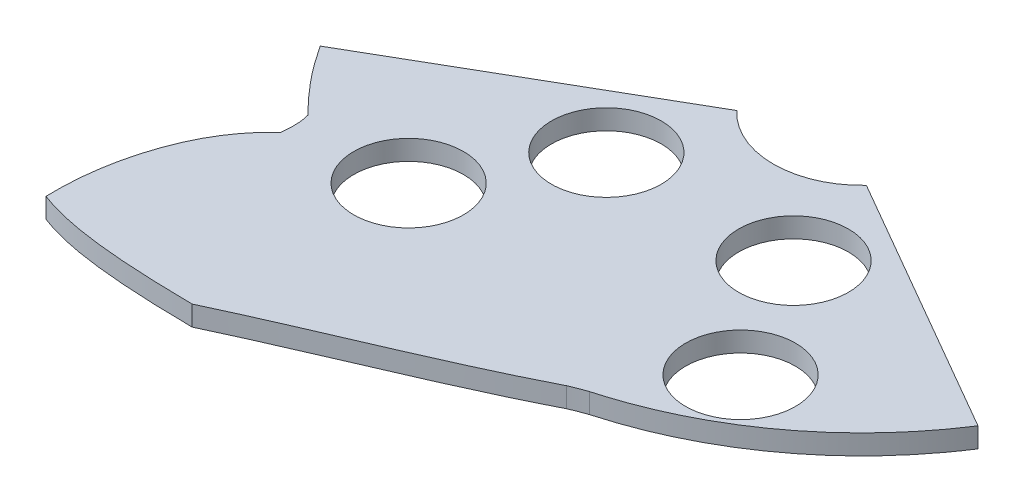
ISO-10303-21;
HEADER;
FILE_DESCRIPTION(('STEP AP214'),'2;1');
FILE_NAME('part.step','',(''),(''),'','','');
FILE_SCHEMA(('AUTOMOTIVE_DESIGN { 1 0 10303 214 1 1 1 1 }'));
ENDSEC;
DATA;
#1=APPLICATION_CONTEXT('core data for automotive mechanical design processes');
#2=APPLICATION_PROTOCOL_DEFINITION('international standard','automotive_design',2000,#1);
#3=PRODUCT_CONTEXT('',#1,'mechanical');
#4=PRODUCT('Part','Part','',(#3));
#5=PRODUCT_RELATED_PRODUCT_CATEGORY('part','',(#4));
#6=PRODUCT_DEFINITION_FORMATION('','',#4);
#7=PRODUCT_DEFINITION_CONTEXT('part definition',#1,'design');
#8=PRODUCT_DEFINITION('design','',#6,#7);
#9=PRODUCT_DEFINITION_SHAPE('','',#8);
#10=(LENGTH_UNIT() NAMED_UNIT(*) SI_UNIT(.MILLI.,.METRE.));
#11=(NAMED_UNIT(*) PLANE_ANGLE_UNIT() SI_UNIT($,.RADIAN.));
#12=(NAMED_UNIT(*) SI_UNIT($,.STERADIAN.) SOLID_ANGLE_UNIT());
#13=UNCERTAINTY_MEASURE_WITH_UNIT(LENGTH_MEASURE(1.E-05),#10,'distance_accuracy_value','');
#14=(GEOMETRIC_REPRESENTATION_CONTEXT(3) GLOBAL_UNCERTAINTY_ASSIGNED_CONTEXT((#13)) GLOBAL_UNIT_ASSIGNED_CONTEXT((#10,
#11,#12)) REPRESENTATION_CONTEXT('',''));
#15=CARTESIAN_POINT('',(0.,0.,0.));
#16=DIRECTION('',(0.,0.,1.));
#17=DIRECTION('',(1.,0.,0.));
#18=AXIS2_PLACEMENT_3D('',#15,#16,#17);
#19=CARTESIAN_POINT('',(-60.8794990415469,-103.736,49.5578745971147));
#20=DIRECTION('',(0.,-1.,0.));
#21=DIRECTION('',(0.,0.,-1.));
#22=AXIS2_PLACEMENT_3D('',#19,#20,#21);
#23=PLANE('',#22);
#24=CARTESIAN_POINT('',(18.75,-103.736,32.476));
#25=DIRECTION('',(0.,-1.,0.));
#26=DIRECTION('',(0.,0.,-1.));
#27=AXIS2_PLACEMENT_3D('',#24,#25,#26);
#28=CIRCLE('',#27,10.999845998306);
#29=CARTESIAN_POINT('',(18.75,-103.736,21.476154001694));
#30=VERTEX_POINT('',#29);
#31=EDGE_CURVE('E441',#30,#30,#28,.T.);
#32=ORIENTED_EDGE('',*,*,#31,.F.);
#33=EDGE_LOOP('',(#32));
#34=FACE_BOUND('',#33,.T.);
#35=CARTESIAN_POINT('',(-33.25,-103.736,57.591));
#36=DIRECTION('',(0.,-1.,0.));
#37=DIRECTION('',(0.,0.,-1.));
#38=AXIS2_PLACEMENT_3D('',#35,#36,#37);
#39=CIRCLE('',#38,10.999845998306);
#40=CARTESIAN_POINT('',(-33.25,-103.736,46.591154001694));
#41=VERTEX_POINT('',#40);
#42=EDGE_CURVE('E422',#41,#41,#39,.T.);
#43=ORIENTED_EDGE('',*,*,#42,.F.);
#44=EDGE_LOOP('',(#43));
#45=FACE_BOUND('',#44,.T.);
#46=CARTESIAN_POINT('',(-65.8942438215736,-103.736,42.6629141284689));
#47=CARTESIAN_POINT('',(-64.3483196135609,-103.736,45.0497912561436));
#48=CARTESIAN_POINT('',(-62.673830398666,-103.736,47.3536259915724));
#49=CARTESIAN_POINT('',(-59.0851730814091,-103.736,51.7621165727287));
#50=CARTESIAN_POINT('',(-57.1695473934687,-103.736,53.8695158523802));
#51=CARTESIAN_POINT('',(-55.1459793703979,-103.736,55.8670629582985));
#52=B_SPLINE_CURVE_WITH_KNOTS('',3,(#46,#47,#48,#49,#50,#51),.UNSPECIFIED.,.F.,.F.,(4,2,4),
(1.50389759401293E-06,0.500001503897594,1.),.UNSPECIFIED.);
#53=CARTESIAN_POINT('',(-55.1459793826158,-103.736,55.8670629706755));
#54=VERTEX_POINT('',#53);
#55=CARTESIAN_POINT('',(-65.8942438215736,-103.736,42.6629141284689));
#56=VERTEX_POINT('',#55);
#57=EDGE_CURVE('E378',#54,#56,#52,.F.);
#58=ORIENTED_EDGE('',*,*,#57,.T.);
#59=DIRECTION('',(0.866025113443951,0.,-0.500000502884138));
#60=VECTOR('',#59,1.);
#61=CARTESIAN_POINT('',(-65.8942438215736,-103.736,42.6629141284689));
#62=LINE('',#61,#60);
#63=CARTESIAN_POINT('',(-12.9766531358799,-103.736,12.1108879302399));
#64=VERTEX_POINT('',#63);
#65=EDGE_CURVE('E103',#56,#64,#62,.T.);
#66=ORIENTED_EDGE('',*,*,#65,.T.);
#67=CARTESIAN_POINT('',(0.,-103.736,0.));
#68=DIRECTION('',(0.,1.,0.));
#69=DIRECTION('',(0.,0.,-1.));
#70=AXIS2_PLACEMENT_3D('',#67,#68,#69);
#71=CIRCLE('',#70,17.7501305084715);
#72=CARTESIAN_POINT('',(12.9766531358511,-103.736,12.1108879302707));
#73=VERTEX_POINT('',#72);
#74=EDGE_CURVE('E272',#64,#73,#71,.T.);
#75=ORIENTED_EDGE('',*,*,#74,.T.);
#76=DIRECTION('',(0.866025113442765,0.,0.500000502886192));
#77=VECTOR('',#76,1.);
#78=CARTESIAN_POINT('',(12.9766531358511,-103.736,12.1108879302707));
#79=LINE('',#78,#77);
#80=CARTESIAN_POINT('',(65.8946490574718,-103.736,42.6631480920524));
#81=VERTEX_POINT('',#80);
#82=EDGE_CURVE('E249',#73,#81,#79,.T.);
#83=ORIENTED_EDGE('',*,*,#82,.T.);
#84=CARTESIAN_POINT('',(21.0226584115678,-103.736,75.6327376439825));
#85=CARTESIAN_POINT('',(25.5929575199006,-103.736,74.3624638863027));
#86=CARTESIAN_POINT('',(30.0480314848837,-103.736,72.6779662009195));
#87=CARTESIAN_POINT('',(36.4452576861579,-103.736,69.5669958342849));
#88=CARTESIAN_POINT('',(38.5329607805169,-103.736,68.4320906274147));
#89=CARTESIAN_POINT('',(42.5949233577799,-103.736,65.9816435785042));
#90=CARTESIAN_POINT('',(44.5678940501253,-103.736,64.6651391924299));
#91=CARTESIAN_POINT('',(50.3020431772606,-103.736,60.4503954685262));
#92=CARTESIAN_POINT('',(53.8706323536897,-103.736,57.2956170400784));
#93=CARTESIAN_POINT('',(60.377928910267,-103.736,50.3927770066135));
#94=CARTESIAN_POINT('',(63.3167748342213,-103.736,46.6451123704599));
#95=CARTESIAN_POINT('',(65.8946490574718,-103.736,42.6631480920524));
#96=B_SPLINE_CURVE_WITH_KNOTS('',3,(#84,#85,#86,#87,#88,#89,#90,#91,#92,#93,#94,#95),
.UNSPECIFIED.,.F.,.F.,(4,2,2,2,2,4),(0.,0.25,0.375,0.499999999999999,0.75,1.),.UNSPECIFIED.);
#97=CARTESIAN_POINT('',(21.0226584115678,-103.736,75.6327376439825));
#98=VERTEX_POINT('',#97);
#99=EDGE_CURVE('E244',#81,#98,#96,.F.);
#100=ORIENTED_EDGE('',*,*,#99,.T.);
#101=CARTESIAN_POINT('',(17.7190487509425,-103.736,76.91092899086));
#102=CARTESIAN_POINT('',(17.8993894929404,-103.736,76.8328952482758));
#103=CARTESIAN_POINT('',(18.2609091236247,-103.736,76.6764667680848));
#104=CARTESIAN_POINT('',(18.809252516718,-103.736,76.4512094775556));
#105=CARTESIAN_POINT('',(19.4518523677748,-103.736,76.1979930739872));
#106=CARTESIAN_POINT('',(20.1892866360565,-103.736,75.9223376445159));
#107=CARTESIAN_POINT('',(20.7450201230001,-103.736,75.7292180932524));
#108=CARTESIAN_POINT('',(21.0226593039177,-103.736,75.6327373964946));
#109=B_SPLINE_CURVE_WITH_KNOTS('',3,(#101,#102,#103,#104,#105,#106,#107,#108),.UNSPECIFIED.,.F.,
.F.,(4,1,1,1,1,4),(0.,0.166356719798098,0.333486041339898,0.501850571956766,0.751094280818291,
0.999930081040374),.UNSPECIFIED.);
#110=CARTESIAN_POINT('',(17.7190487509425,-103.736,76.91092899086));
#111=VERTEX_POINT('',#110);
#112=EDGE_CURVE('E321',#98,#111,#109,.F.);
#113=ORIENTED_EDGE('',*,*,#112,.T.);
#114=CARTESIAN_POINT('',(-33.9641115162834,-103.736,100.253751586725));
#115=CARTESIAN_POINT('',(-33.1170609370134,-103.736,99.8565548226537));
#116=CARTESIAN_POINT('',(-31.4097538081312,-103.736,99.0559687850964));
#117=CARTESIAN_POINT('',(-26.2931336097291,-103.736,96.7194953232864));
#118=CARTESIAN_POINT('',(-18.4549035524711,-103.736,93.2836855038546));
#119=CARTESIAN_POINT('',(-9.84603892711754,-103.736,89.5941792714876));
#120=CARTESIAN_POINT('',(-2.8103699727978,-103.736,86.5333560357378));
#121=CARTESIAN_POINT('',(2.38302904238515,-103.736,84.2336566869377));
#122=CARTESIAN_POINT('',(7.70214394411995,-103.736,81.8028617372757));
#123=CARTESIAN_POINT('',(11.5342339288429,-103.736,79.981513339499));
#124=CARTESIAN_POINT('',(14.0624564870278,-103.736,78.7442554355584));
#125=CARTESIAN_POINT('',(15.2661134264555,-103.736,78.1483962028157));
#126=CARTESIAN_POINT('',(16.4877144370256,-103.736,77.5370202733556));
#127=CARTESIAN_POINT('',(17.3063206687018,-103.736,77.1207869263532));
#128=CARTESIAN_POINT('',(17.7190487509425,-103.736,76.91092899086));
#129=B_SPLINE_CURVE_WITH_KNOTS('',3,(#114,#115,#116,#117,#118,#119,#120,#121,#122,#123,#124,
#125,#126,#127,#128),.UNSPECIFIED.,.F.,.F.,(4,1,1,1,1,1,1,1,1,1,1,1,4),(-3.17790387382999E-06,
0.0494810058856682,0.0997366744950436,0.297508692178171,0.502127867938829,0.595146850620623,
0.703337447947189,0.802545632139261,0.904470423531484,0.927745678376964,0.951425603385118,
0.975509576453504,1.00000000000024),.UNSPECIFIED.);
#130=CARTESIAN_POINT('',(-33.9641115162834,-103.736,100.253751586725));
#131=VERTEX_POINT('',#130);
#132=EDGE_CURVE('E129',#111,#131,#129,.F.);
#133=ORIENTED_EDGE('',*,*,#132,.T.);
#134=CARTESIAN_POINT('',(-1676.56667391095,-103.736,1233.5765258698));
#135=CARTESIAN_POINT('',(2151.72810762779,-103.736,-1020.70613769245));
#136=CARTESIAN_POINT('',(-2163.37139860247,-103.736,1201.62099970687));
#137=CARTESIAN_POINT('',(1619.47402337585,-103.736,-975.583439376867));
#138=B_SPLINE_CURVE_WITH_KNOTS('',3,(#134,#135,#136,#137),.UNSPECIFIED.,.F.,.F.,(4,4),
(-9.48625111077812,8.41653249510938),.UNSPECIFIED.);
#139=CARTESIAN_POINT('',(-67.2945538085972,-103.736,96.1953949658447));
#140=VERTEX_POINT('',#139);
#141=EDGE_CURVE('E122',#131,#140,#138,.T.);
#142=ORIENTED_EDGE('',*,*,#141,.T.);
#143=CARTESIAN_POINT('',(-54.8745015138517,-103.736,61.603728229671));
#144=CARTESIAN_POINT('',(-55.1382195845281,-103.736,61.8496684118101));
#145=CARTESIAN_POINT('',(-55.6635644717233,-103.736,62.3395981362857));
#146=CARTESIAN_POINT('',(-56.4164675468631,-103.736,63.1053670208488));
#147=CARTESIAN_POINT('',(-57.1399138446926,-103.736,63.8890100781104));
#148=CARTESIAN_POINT('',(-57.8323660160943,-103.736,64.6925044878559));
#149=CARTESIAN_POINT('',(-58.9137090509901,-103.736,66.033961145518));
#150=CARTESIAN_POINT('',(-60.2977156730155,-103.736,67.9936098134287));
#151=CARTESIAN_POINT('',(-61.825172993518,-103.736,70.6258602697069));
#152=CARTESIAN_POINT('',(-63.1434853344286,-103.736,73.3877784507059));
#153=CARTESIAN_POINT('',(-64.2626977837156,-103.736,76.2455207055547));
#154=CARTESIAN_POINT('',(-65.2021522571827,-103.736,79.1756233955872));
#155=CARTESIAN_POINT('',(-66.2173678428524,-103.736,83.1039027611529));
#156=CARTESIAN_POINT('',(-66.8964960576645,-103.736,87.0766900209124));
#157=CARTESIAN_POINT('',(-67.201314713959,-103.736,90.5638299962859));
#158=CARTESIAN_POINT('',(-67.2952193815071,-103.736,92.5601781662702));
#159=CARTESIAN_POINT('',(-67.3199857253424,-103.736,93.7637903390918));
#160=CARTESIAN_POINT('',(-67.3210496480398,-103.736,94.7202910804832));
#161=CARTESIAN_POINT('',(-67.3143342294464,-103.736,95.427540082676));
#162=CARTESIAN_POINT('',(-67.3014071681895,-103.736,95.9293552289428));
#163=CARTESIAN_POINT('',(-67.2945538237707,-103.736,96.1953949662356));
#164=B_SPLINE_CURVE_WITH_KNOTS('',3,(#143,#144,#145,#146,#147,#148,#149,#150,#151,#152,#153,
#154,#155,#156,#157,#158,#159,#160,#161,#162,#163),.UNSPECIFIED.,.F.,.F.,(4,1,1,1,1,1,1,1,1,1,1,
1,1,1,1,1,1,1,4),(9.37593114258561E-10,0.0285817969401631,0.0569369226240535,0.0851021152195438,
0.113112091908872,0.140999917214765,0.221667996367629,0.302984954107485,0.381956788399134,
0.464034928640712,0.546083801532815,0.625717234318684,0.785530490834855,0.864793693461652,
0.903084768676125,0.943937207286041,0.960209443463652,0.978905070849993,1.00000048457488),.UNSPECIFIED.);
#165=CARTESIAN_POINT('',(-54.8745015138517,-103.736,61.603728229671));
#166=VERTEX_POINT('',#165);
#167=EDGE_CURVE('E126',#140,#166,#164,.F.);
#168=ORIENTED_EDGE('',*,*,#167,.T.);
#169=CARTESIAN_POINT('',(-55.1459793826158,-103.736,55.8670629706755));
#170=CARTESIAN_POINT('',(-55.119670456841,-103.736,55.9576110496734));
#171=CARTESIAN_POINT('',(-55.0669837738367,-103.736,56.1389441065853));
#172=CARTESIAN_POINT('',(-54.9984628143318,-103.736,56.4142835992523));
#173=CARTESIAN_POINT('',(-54.9373607226606,-103.736,56.692306938184));
#174=CARTESIAN_POINT('',(-54.8842914367142,-103.736,56.9731696672198));
#175=CARTESIAN_POINT('',(-54.8163543533673,-103.736,57.3976193219257));
#176=CARTESIAN_POINT('',(-54.7512846973658,-103.736,57.9781204967936));
#177=CARTESIAN_POINT('',(-54.7128088699196,-103.736,58.7055284569185));
#178=CARTESIAN_POINT('',(-54.7099311380961,-103.736,59.4433791170247));
#179=CARTESIAN_POINT('',(-54.7382326076146,-103.736,60.1726854416776));
#180=CARTESIAN_POINT('',(-54.7906438323049,-103.736,60.8962253389293));
#181=CARTESIAN_POINT('',(-54.8467716733781,-103.736,61.3697739627799));
#182=CARTESIAN_POINT('',(-54.8745015138517,-103.736,61.603728229671));
#183=B_SPLINE_CURVE_WITH_KNOTS('',3,(#169,#170,#171,#172,#173,#174,#175,#176,#177,#178,#179,
#180,#181,#182),.UNSPECIFIED.,.F.,.F.,(4,1,1,1,1,1,1,1,1,1,1,4),(3.85183742346307E-06,
0.0489096168330567,0.0979433328889345,0.147143818022804,0.196546128036595,0.246181519942547,
0.370085425655522,0.499313428583158,0.623837341682672,0.752677982214345,0.877811817897942,1.),.UNSPECIFIED.);
#184=EDGE_CURVE('E51',#166,#54,#183,.F.);
#185=ORIENTED_EDGE('',*,*,#184,.T.);
#186=EDGE_LOOP('',(#58,#66,#75,#83,#100,#113,#133,#142,#168,#185));
#187=FACE_BOUND('',#186,.T.);
#188=CARTESIAN_POINT('',(33.25,-103.736,57.591));
#189=DIRECTION('',(0.,-1.,0.));
#190=DIRECTION('',(0.,0.,-1.));
#191=AXIS2_PLACEMENT_3D('',#188,#189,#190);
#192=CIRCLE('',#191,10.999845998306);
#193=CARTESIAN_POINT('',(33.25,-103.736,46.591154001694));
#194=VERTEX_POINT('',#193);
#195=EDGE_CURVE('E429',#194,#194,#192,.T.);
#196=ORIENTED_EDGE('',*,*,#195,.F.);
#197=EDGE_LOOP('',(#196));
#198=FACE_BOUND('',#197,.T.);
#199=CARTESIAN_POINT('',(-18.75,-103.736,32.476));
#200=DIRECTION('',(0.,-1.,0.));
#201=DIRECTION('',(0.,0.,-1.));
#202=AXIS2_PLACEMENT_3D('',#199,#200,#201);
#203=CIRCLE('',#202,10.999845998306);
#204=CARTESIAN_POINT('',(-18.75,-103.736,21.476154001694));
#205=VERTEX_POINT('',#204);
#206=EDGE_CURVE('E447',#205,#205,#203,.T.);
#207=ORIENTED_EDGE('',*,*,#206,.F.);
#208=EDGE_LOOP('',(#207));
#209=FACE_BOUND('',#208,.T.);
#210=ADVANCED_FACE('F30',(#34,#45,#187,#198,#209),#23,.T.);
#211=CARTESIAN_POINT('',(-60.8794990415469,-99.736,49.5578745971147));
#212=DIRECTION('',(0.,-1.,0.));
#213=DIRECTION('',(0.,0.,-1.));
#214=AXIS2_PLACEMENT_3D('',#211,#212,#213);
#215=PLANE('',#214);
#216=CARTESIAN_POINT('',(18.75,-99.736,32.476));
#217=DIRECTION('',(0.,-1.,0.));
#218=DIRECTION('',(0.,0.,-1.));
#219=AXIS2_PLACEMENT_3D('',#216,#217,#218);
#220=CIRCLE('',#219,10.999845998306);
#221=CARTESIAN_POINT('',(18.75,-99.736,21.476154001694));
#222=VERTEX_POINT('',#221);
#223=EDGE_CURVE('E444',#222,#222,#220,.T.);
#224=ORIENTED_EDGE('',*,*,#223,.T.);
#225=EDGE_LOOP('',(#224));
#226=FACE_BOUND('',#225,.T.);
#227=CARTESIAN_POINT('',(-33.25,-99.736,57.591));
#228=DIRECTION('',(0.,-1.,0.));
#229=DIRECTION('',(0.,0.,-1.));
#230=AXIS2_PLACEMENT_3D('',#227,#228,#229);
#231=CIRCLE('',#230,10.999845998306);
#232=CARTESIAN_POINT('',(-33.25,-99.736,46.591154001694));
#233=VERTEX_POINT('',#232);
#234=EDGE_CURVE('E424',#233,#233,#231,.T.);
#235=ORIENTED_EDGE('',*,*,#234,.T.);
#236=EDGE_LOOP('',(#235));
#237=FACE_BOUND('',#236,.T.);
#238=CARTESIAN_POINT('',(-55.1459793703979,-99.736,55.8670629582985));
#239=CARTESIAN_POINT('',(-57.1695473934687,-99.736,53.8695158523802));
#240=CARTESIAN_POINT('',(-59.0851730814091,-99.7359999999999,51.7621165727287));
#241=CARTESIAN_POINT('',(-62.673830398666,-99.7359999999999,47.3536259915724));
#242=CARTESIAN_POINT('',(-64.3483196135609,-99.7359999999999,45.0497912561436));
#243=CARTESIAN_POINT('',(-65.8942438215736,-99.7359999999999,42.6629141284689));
#244=B_SPLINE_CURVE_WITH_KNOTS('',3,(#238,#239,#240,#241,#242,#243),.UNSPECIFIED.,.F.,.F.,(4,2,
4),(1.5038975939623E-06,0.5,1.),.UNSPECIFIED.);
#245=CARTESIAN_POINT('',(-55.1459793826158,-99.736,55.8670629706755));
#246=VERTEX_POINT('',#245);
#247=CARTESIAN_POINT('',(-65.8942438215736,-99.736,42.6629141284689));
#248=VERTEX_POINT('',#247);
#249=EDGE_CURVE('E405',#246,#248,#244,.T.);
#250=ORIENTED_EDGE('',*,*,#249,.F.);
#251=CARTESIAN_POINT('',(-54.8745015138517,-99.736,61.603728229671));
#252=CARTESIAN_POINT('',(-54.8467716733781,-99.736,61.3697739627799));
#253=CARTESIAN_POINT('',(-54.7906438323049,-99.736,60.8962253389293));
#254=CARTESIAN_POINT('',(-54.7382326076146,-99.736,60.1726854416776));
#255=CARTESIAN_POINT('',(-54.7099311380961,-99.736,59.4433791170247));
#256=CARTESIAN_POINT('',(-54.7128088699196,-99.736,58.7055284569185));
#257=CARTESIAN_POINT('',(-54.7512846973658,-99.736,57.9781204967936));
#258=CARTESIAN_POINT('',(-54.8163543533673,-99.736,57.3976193219257));
#259=CARTESIAN_POINT('',(-54.8842914367142,-99.736,56.9731696672198));
#260=CARTESIAN_POINT('',(-54.9373607226606,-99.736,56.692306938184));
#261=CARTESIAN_POINT('',(-54.9984628143318,-99.736,56.4142835992523));
#262=CARTESIAN_POINT('',(-55.0669837738367,-99.736,56.1389441065853));
#263=CARTESIAN_POINT('',(-55.119670456841,-99.736,55.9576110496734));
#264=CARTESIAN_POINT('',(-55.1459793826158,-99.736,55.8670629706755));
#265=B_SPLINE_CURVE_WITH_KNOTS('',3,(#251,#252,#253,#254,#255,#256,#257,#258,#259,#260,#261,
#262,#263,#264),.UNSPECIFIED.,.F.,.F.,(4,1,1,1,1,1,1,1,1,1,1,4),(3.85183742350113E-06,
0.122192033939482,0.247325869623078,0.376166510154752,0.500690423254266,0.629918426181901,
0.753822331894876,0.803457723800828,0.85286003381462,0.902060518948489,0.951094235004367,1.),.UNSPECIFIED.);
#266=CARTESIAN_POINT('',(-54.8745015138517,-99.736,61.603728229671));
#267=VERTEX_POINT('',#266);
#268=EDGE_CURVE('E94',#267,#246,#265,.T.);
#269=ORIENTED_EDGE('',*,*,#268,.F.);
#270=CARTESIAN_POINT('',(-67.2945538237707,-99.736,96.1953949662356));
#271=CARTESIAN_POINT('',(-67.3014071681895,-99.736,95.9293552289428));
#272=CARTESIAN_POINT('',(-67.3143342294464,-99.736,95.427540082676));
#273=CARTESIAN_POINT('',(-67.3210496480398,-99.736,94.7202910804832));
#274=CARTESIAN_POINT('',(-67.3199857253424,-99.736,93.7637903390918));
#275=CARTESIAN_POINT('',(-67.2952193815071,-99.736,92.5601781662702));
#276=CARTESIAN_POINT('',(-67.201314713959,-99.736,90.5638299962859));
#277=CARTESIAN_POINT('',(-66.8964960576645,-99.736,87.0766900209124));
#278=CARTESIAN_POINT('',(-66.2173678428524,-99.736,83.1039027611529));
#279=CARTESIAN_POINT('',(-65.2021522571827,-99.736,79.1756233955872));
#280=CARTESIAN_POINT('',(-64.2626977837156,-99.736,76.2455207055547));
#281=CARTESIAN_POINT('',(-63.1434853344286,-99.736,73.3877784507059));
#282=CARTESIAN_POINT('',(-61.825172993518,-99.736,70.6258602697069));
#283=CARTESIAN_POINT('',(-60.2977156730155,-99.736,67.9936098134287));
#284=CARTESIAN_POINT('',(-58.9137090509901,-99.736,66.033961145518));
#285=CARTESIAN_POINT('',(-57.8323660160943,-99.736,64.6925044878559));
#286=CARTESIAN_POINT('',(-57.1399138446926,-99.736,63.8890100781104));
#287=CARTESIAN_POINT('',(-56.4164675468631,-99.736,63.1053670208488));
#288=CARTESIAN_POINT('',(-55.6635644717233,-99.736,62.3395981362857));
#289=CARTESIAN_POINT('',(-55.1382195845281,-99.736,61.8496684118101));
#290=CARTESIAN_POINT('',(-54.8745015138517,-99.736,61.603728229671));
#291=B_SPLINE_CURVE_WITH_KNOTS('',3,(#270,#271,#272,#273,#274,#275,#276,#277,#278,#279,#280,
#281,#282,#283,#284,#285,#286,#287,#288,#289,#290),.UNSPECIFIED.,.F.,.F.,(4,1,1,1,1,1,1,1,1,1,1,
1,1,1,1,1,1,1,4),(9.37593132511023E-10,0.0210954146624788,0.0397910420488202,0.0560632782264308,
0.0969157168363468,0.13520679205082,0.214469994677617,0.374283251193788,0.453916683979657,
0.53596555687176,0.618043697113338,0.697015531404987,0.778332489144843,0.859000568297707,
0.8868883936036,0.914898370292928,0.943063562888419,0.971418688572309,1.00000048457488),.UNSPECIFIED.);
#292=CARTESIAN_POINT('',(-67.2945538085972,-99.736,96.1953949658447));
#293=VERTEX_POINT('',#292);
#294=EDGE_CURVE('E87',#293,#267,#291,.T.);
#295=ORIENTED_EDGE('',*,*,#294,.F.);
#296=CARTESIAN_POINT('',(-1676.56667391095,-99.736,1233.5765258698));
#297=CARTESIAN_POINT('',(2151.72810762779,-99.736,-1020.70613769245));
#298=CARTESIAN_POINT('',(-2163.37139860247,-99.736,1201.62099970687));
#299=CARTESIAN_POINT('',(1619.47402337585,-99.736,-975.583439376867));
#300=B_SPLINE_CURVE_WITH_KNOTS('',3,(#296,#297,#298,#299),.UNSPECIFIED.,.F.,.F.,(4,4),
(-9.48625111077812,8.41653249510938),.UNSPECIFIED.);
#301=CARTESIAN_POINT('',(-33.9641115162834,-99.736,100.253751586725));
#302=VERTEX_POINT('',#301);
#303=EDGE_CURVE('E138',#302,#293,#300,.T.);
#304=ORIENTED_EDGE('',*,*,#303,.F.);
#305=CARTESIAN_POINT('',(17.7190487509425,-99.7359999999999,76.91092899086));
#306=CARTESIAN_POINT('',(17.3063206687018,-99.7359999999999,77.1207869263532));
#307=CARTESIAN_POINT('',(16.4877144370256,-99.7359999999999,77.5370202733556));
#308=CARTESIAN_POINT('',(15.2661134264555,-99.7359999999999,78.1483962028157));
#309=CARTESIAN_POINT('',(14.0624564870278,-99.7359999999999,78.7442554355584));
#310=CARTESIAN_POINT('',(11.5342339288429,-99.7359999999999,79.981513339499));
#311=CARTESIAN_POINT('',(7.70214394411995,-99.7359999999999,81.8028617372757));
#312=CARTESIAN_POINT('',(2.38302904238515,-99.7359999999999,84.2336566869377));
#313=CARTESIAN_POINT('',(-2.8103699727978,-99.7359999999999,86.5333560357378));
#314=CARTESIAN_POINT('',(-9.84603892711754,-99.7359999999999,89.5941792714876));
#315=CARTESIAN_POINT('',(-18.4549035524711,-99.7359999999999,93.2836855038546));
#316=CARTESIAN_POINT('',(-26.2931336097291,-99.7359999999999,96.7194953232864));
#317=CARTESIAN_POINT('',(-31.4097538081312,-99.7359999999999,99.0559687850964));
#318=CARTESIAN_POINT('',(-33.1170609370134,-99.7359999999999,99.8565548226537));
#319=CARTESIAN_POINT('',(-33.9641115162834,-99.7359999999999,100.253751586725));
#320=B_SPLINE_CURVE_WITH_KNOTS('',3,(#305,#306,#307,#308,#309,#310,#311,#312,#313,#314,#315,
#316,#317,#318,#319),.UNSPECIFIED.,.F.,.F.,(4,1,1,1,1,1,1,1,1,1,1,1,4),(-3.17790387377602E-06,
0.0244872456428649,0.0485712187112518,0.0722511437194048,0.0955263985648858,0.197451189957109,
0.29665937414918,0.404849971475746,0.49786895415754,0.702488129918199,0.900260147601326,
0.950515816210701,1.00000000000024),.UNSPECIFIED.);
#321=CARTESIAN_POINT('',(17.7190487509425,-99.736,76.91092899086));
#322=VERTEX_POINT('',#321);
#323=EDGE_CURVE('E312',#322,#302,#320,.T.);
#324=ORIENTED_EDGE('',*,*,#323,.F.);
#325=CARTESIAN_POINT('',(21.0226593039177,-99.736,75.6327373964946));
#326=CARTESIAN_POINT('',(20.7450201230001,-99.736,75.7292180932524));
#327=CARTESIAN_POINT('',(20.1892866360565,-99.736,75.9223376445159));
#328=CARTESIAN_POINT('',(19.4518523677748,-99.736,76.1979930739872));
#329=CARTESIAN_POINT('',(18.809252516718,-99.736,76.4512094775556));
#330=CARTESIAN_POINT('',(18.2609091236247,-99.736,76.6764667680848));
#331=CARTESIAN_POINT('',(17.8993894929404,-99.736,76.8328952482758));
#332=CARTESIAN_POINT('',(17.7190487509425,-99.736,76.91092899086));
#333=B_SPLINE_CURVE_WITH_KNOTS('',3,(#325,#326,#327,#328,#329,#330,#331,#332),.UNSPECIFIED.,.F.,
.F.,(4,1,1,1,1,4),(0.,0.248835800222083,0.498079509083608,0.666444039700475,0.833573361242276,
0.999930081040374),.UNSPECIFIED.);
#334=CARTESIAN_POINT('',(21.0226584115678,-99.736,75.6327376439825));
#335=VERTEX_POINT('',#334);
#336=EDGE_CURVE('E327',#335,#322,#333,.T.);
#337=ORIENTED_EDGE('',*,*,#336,.F.);
#338=CARTESIAN_POINT('',(65.8946490574718,-99.736,42.6631480920524));
#339=CARTESIAN_POINT('',(63.3167748342213,-99.736,46.6451123704599));
#340=CARTESIAN_POINT('',(60.377928910267,-99.736,50.3927770066135));
#341=CARTESIAN_POINT('',(53.8706323536897,-99.736,57.2956170400784));
#342=CARTESIAN_POINT('',(50.3020431772606,-99.736,60.4503954685262));
#343=CARTESIAN_POINT('',(44.5678940501253,-99.736,64.6651391924299));
#344=CARTESIAN_POINT('',(42.5949233577799,-99.736,65.9816435785042));
#345=CARTESIAN_POINT('',(38.5329607805169,-99.736,68.4320906274147));
#346=CARTESIAN_POINT('',(36.4452576861579,-99.736,69.5669958342849));
#347=CARTESIAN_POINT('',(30.0480314848837,-99.736,72.6779662009195));
#348=CARTESIAN_POINT('',(25.5929575199006,-99.736,74.3624638863027));
#349=CARTESIAN_POINT('',(21.0226584115678,-99.736,75.6327376439825));
#350=B_SPLINE_CURVE_WITH_KNOTS('',3,(#338,#339,#340,#341,#342,#343,#344,#345,#346,#347,#348,
#349),.UNSPECIFIED.,.F.,.F.,(4,2,2,2,2,4),(0.,0.25,0.500000000000001,0.625,0.75,1.),.UNSPECIFIED.);
#351=CARTESIAN_POINT('',(65.8946490574718,-99.736,42.6631480920524));
#352=VERTEX_POINT('',#351);
#353=EDGE_CURVE('E363',#352,#335,#350,.T.);
#354=ORIENTED_EDGE('',*,*,#353,.F.);
#355=DIRECTION('',(0.866025113442765,0.,0.500000502886192));
#356=VECTOR('',#355,1.);
#357=CARTESIAN_POINT('',(12.9766531358511,-99.736,12.1108879302707));
#358=LINE('',#357,#356);
#359=CARTESIAN_POINT('',(12.9766531358511,-99.736,12.1108879302707));
#360=VERTEX_POINT('',#359);
#361=EDGE_CURVE('E188',#360,#352,#358,.T.);
#362=ORIENTED_EDGE('',*,*,#361,.F.);
#363=CARTESIAN_POINT('',(0.,-99.736,0.));
#364=DIRECTION('',(0.,1.,0.));
#365=DIRECTION('',(0.,0.,-1.));
#366=AXIS2_PLACEMENT_3D('',#363,#364,#365);
#367=CIRCLE('',#366,17.7501305084715);
#368=CARTESIAN_POINT('',(-12.9766531358799,-99.736,12.1108879302399));
#369=VERTEX_POINT('',#368);
#370=EDGE_CURVE('E183',#369,#360,#367,.T.);
#371=ORIENTED_EDGE('',*,*,#370,.F.);
#372=DIRECTION('',(0.866025113443951,0.,-0.500000502884138));
#373=VECTOR('',#372,1.);
#374=CARTESIAN_POINT('',(-65.8942438215736,-99.736,42.6629141284689));
#375=LINE('',#374,#373);
#376=EDGE_CURVE('E189',#248,#369,#375,.T.);
#377=ORIENTED_EDGE('',*,*,#376,.F.);
#378=EDGE_LOOP('',(#250,#269,#295,#304,#324,#337,#354,#362,#371,#377));
#379=FACE_BOUND('',#378,.T.);
#380=CARTESIAN_POINT('',(33.25,-99.736,57.591));
#381=DIRECTION('',(0.,-1.,0.));
#382=DIRECTION('',(0.,0.,-1.));
#383=AXIS2_PLACEMENT_3D('',#380,#381,#382);
#384=CIRCLE('',#383,10.999845998306);
#385=CARTESIAN_POINT('',(33.25,-99.736,46.591154001694));
#386=VERTEX_POINT('',#385);
#387=EDGE_CURVE('E432',#386,#386,#384,.T.);
#388=ORIENTED_EDGE('',*,*,#387,.T.);
#389=EDGE_LOOP('',(#388));
#390=FACE_BOUND('',#389,.T.);
#391=CARTESIAN_POINT('',(-18.75,-99.736,32.476));
#392=DIRECTION('',(0.,-1.,0.));
#393=DIRECTION('',(0.,0.,-1.));
#394=AXIS2_PLACEMENT_3D('',#391,#392,#393);
#395=CIRCLE('',#394,10.999845998306);
#396=CARTESIAN_POINT('',(-18.75,-99.736,21.476154001694));
#397=VERTEX_POINT('',#396);
#398=EDGE_CURVE('E450',#397,#397,#395,.T.);
#399=ORIENTED_EDGE('',*,*,#398,.T.);
#400=EDGE_LOOP('',(#399));
#401=FACE_BOUND('',#400,.T.);
#402=ADVANCED_FACE('F208',(#226,#237,#379,#390,#401),#215,.F.);
#403=CARTESIAN_POINT('',(-55.1459611109056,-103.736,55.8670809829874));
#404=CARTESIAN_POINT('',(-57.1695358698135,-103.736,53.8695285296683));
#405=CARTESIAN_POINT('',(-59.0851676844279,-103.736,51.7621232026571));
#406=CARTESIAN_POINT('',(-62.673830398666,-103.736,47.3536259915724));
#407=CARTESIAN_POINT('',(-64.3483196135609,-103.736,45.0497912561436));
#408=CARTESIAN_POINT('',(-65.8942438215736,-103.736,42.6629141284689));
#409=B_SPLINE_CURVE_WITH_KNOTS('',3,(#403,#404,#405,#406,#407,#408),.UNSPECIFIED.,.F.,.F.,(4,2,
4),(0.,0.5,1.),.UNSPECIFIED.);
#410=DIRECTION('',(0.,1.,0.));
#411=VECTOR('',#410,1.);
#412=SURFACE_OF_LINEAR_EXTRUSION('',#409,#411);
#413=ORIENTED_EDGE('',*,*,#249,.T.);
#414=DIRECTION('',(0.,1.,0.));
#415=VECTOR('',#414,1.);
#416=CARTESIAN_POINT('',(-65.8942438215736,-103.736,42.6629141284689));
#417=LINE('',#416,#415);
#418=EDGE_CURVE('E11',#56,#248,#417,.T.);
#419=ORIENTED_EDGE('',*,*,#418,.F.);
#420=ORIENTED_EDGE('',*,*,#57,.F.);
#421=DIRECTION('',(0.,1.,0.));
#422=VECTOR('',#421,1.);
#423=CARTESIAN_POINT('',(-55.1459793826158,-103.736,55.8670629706755));
#424=LINE('',#423,#422);
#425=EDGE_CURVE('E652',#54,#246,#424,.T.);
#426=ORIENTED_EDGE('',*,*,#425,.T.);
#427=EDGE_LOOP('',(#413,#419,#420,#426));
#428=FACE_BOUND('',#427,.T.);
#429=ADVANCED_FACE('F32',(#428),#412,.F.);
#430=CARTESIAN_POINT('',(-65.8942438215736,-103.736,42.6629141284689));
#431=DIRECTION('',(0.500000502884138,0.,0.866025113443951));
#432=DIRECTION('',(0.866025113443951,0.,-0.500000502884138));
#433=AXIS2_PLACEMENT_3D('',#430,#431,#432);
#434=PLANE('',#433);
#435=ORIENTED_EDGE('',*,*,#376,.T.);
#436=DIRECTION('',(0.,1.,0.));
#437=VECTOR('',#436,1.);
#438=CARTESIAN_POINT('',(-12.9766531358799,-103.736,12.1108879302399));
#439=LINE('',#438,#437);
#440=EDGE_CURVE('E42',#64,#369,#439,.T.);
#441=ORIENTED_EDGE('',*,*,#440,.F.);
#442=ORIENTED_EDGE('',*,*,#65,.F.);
#443=ORIENTED_EDGE('',*,*,#418,.T.);
#444=EDGE_LOOP('',(#435,#441,#442,#443));
#445=FACE_BOUND('',#444,.T.);
#446=ADVANCED_FACE('F469',(#445),#434,.F.);
#447=CARTESIAN_POINT('',(0.,-103.736,0.));
#448=DIRECTION('',(0.,1.,0.));
#449=DIRECTION('',(0.,0.,1.));
#450=AXIS2_PLACEMENT_3D('',#447,#448,#449);
#451=CYLINDRICAL_SURFACE('',#450,17.7501305084715);
#452=ORIENTED_EDGE('',*,*,#370,.T.);
#453=DIRECTION('',(0.,1.,0.));
#454=VECTOR('',#453,1.);
#455=CARTESIAN_POINT('',(12.9766531358511,-103.736,12.1108879302707));
#456=LINE('',#455,#454);
#457=EDGE_CURVE('E190',#73,#360,#456,.T.);
#458=ORIENTED_EDGE('',*,*,#457,.F.);
#459=ORIENTED_EDGE('',*,*,#74,.F.);
#460=ORIENTED_EDGE('',*,*,#440,.T.);
#461=EDGE_LOOP('',(#452,#458,#459,#460));
#462=FACE_BOUND('',#461,.T.);
#463=ADVANCED_FACE('F517',(#462),#451,.F.);
#464=CARTESIAN_POINT('',(12.9766531358511,-103.736,12.1108879302707));
#465=DIRECTION('',(-0.500000502886193,0.,0.866025113442765));
#466=DIRECTION('',(0.866025113442765,0.,0.500000502886193));
#467=AXIS2_PLACEMENT_3D('',#464,#465,#466);
#468=PLANE('',#467);
#469=ORIENTED_EDGE('',*,*,#361,.T.);
#470=DIRECTION('',(0.,1.,0.));
#471=VECTOR('',#470,1.);
#472=CARTESIAN_POINT('',(65.8946490574718,-103.736,42.6631480920524));
#473=LINE('',#472,#471);
#474=EDGE_CURVE('E193',#81,#352,#473,.T.);
#475=ORIENTED_EDGE('',*,*,#474,.F.);
#476=ORIENTED_EDGE('',*,*,#82,.F.);
#477=ORIENTED_EDGE('',*,*,#457,.T.);
#478=EDGE_LOOP('',(#469,#475,#476,#477));
#479=FACE_BOUND('',#478,.T.);
#480=ADVANCED_FACE('F263',(#479),#468,.F.);
#481=CARTESIAN_POINT('',(65.8946490574718,-103.736,42.6631480920524));
#482=CARTESIAN_POINT('',(63.3167748342213,-103.736,46.6451123704599));
#483=CARTESIAN_POINT('',(60.377928910267,-103.736,50.3927770066135));
#484=CARTESIAN_POINT('',(53.8706323536897,-103.736,57.2956170400784));
#485=CARTESIAN_POINT('',(50.3020431772606,-103.736,60.4503954685262));
#486=CARTESIAN_POINT('',(44.5678940501253,-103.736,64.6651391924299));
#487=CARTESIAN_POINT('',(42.5949233577799,-103.736,65.9816435785042));
#488=CARTESIAN_POINT('',(38.5329607805169,-103.736,68.4320906274147));
#489=CARTESIAN_POINT('',(36.4452576861579,-103.736,69.5669958342849));
#490=CARTESIAN_POINT('',(30.0480314848837,-103.736,72.6779662009195));
#491=CARTESIAN_POINT('',(25.5929575199006,-103.736,74.3624638863027));
#492=CARTESIAN_POINT('',(21.0226584115678,-103.736,75.6327376439825));
#493=B_SPLINE_CURVE_WITH_KNOTS('',3,(#481,#482,#483,#484,#485,#486,#487,#488,#489,#490,#491,
#492),.UNSPECIFIED.,.F.,.F.,(4,2,2,2,2,4),(0.,0.25,0.500000000000001,0.625,0.75,1.),.UNSPECIFIED.);
#494=DIRECTION('',(0.,1.,0.));
#495=VECTOR('',#494,1.);
#496=SURFACE_OF_LINEAR_EXTRUSION('',#493,#495);
#497=ORIENTED_EDGE('',*,*,#353,.T.);
#498=DIRECTION('',(0.,1.,0.));
#499=VECTOR('',#498,1.);
#500=CARTESIAN_POINT('',(21.0226584115678,-103.736,75.6327376439825));
#501=LINE('',#500,#499);
#502=EDGE_CURVE('E329',#98,#335,#501,.T.);
#503=ORIENTED_EDGE('',*,*,#502,.F.);
#504=ORIENTED_EDGE('',*,*,#99,.F.);
#505=ORIENTED_EDGE('',*,*,#474,.T.);
#506=EDGE_LOOP('',(#497,#503,#504,#505));
#507=FACE_BOUND('',#506,.T.);
#508=ADVANCED_FACE('F251',(#507),#496,.F.);
#509=CARTESIAN_POINT('',(21.0226593039177,-103.736,75.6327373964946));
#510=CARTESIAN_POINT('',(20.7450201230001,-103.736,75.7292180932524));
#511=CARTESIAN_POINT('',(20.1892866360565,-103.736,75.9223376445159));
#512=CARTESIAN_POINT('',(19.4518523677748,-103.736,76.1979930739872));
#513=CARTESIAN_POINT('',(18.809252516718,-103.736,76.4512094775556));
#514=CARTESIAN_POINT('',(18.2608327271798,-103.736,76.6764981514413));
#515=CARTESIAN_POINT('',(17.8992379000559,-103.736,76.8329608424216));
#516=CARTESIAN_POINT('',(17.7188213618043,-103.736,76.9110273825231));
#517=B_SPLINE_CURVE_WITH_KNOTS('',3,(#509,#510,#511,#512,#513,#514,#515,#516),.UNSPECIFIED.,.F.,
.F.,(4,1,1,1,1,4),(0.,0.248835800222083,0.498079509083608,0.666444039700475,0.833573361242276,
1.),.UNSPECIFIED.);
#518=DIRECTION('',(0.,1.,0.));
#519=VECTOR('',#518,1.);
#520=SURFACE_OF_LINEAR_EXTRUSION('',#517,#519);
#521=ORIENTED_EDGE('',*,*,#336,.T.);
#522=DIRECTION('',(0.,1.,0.));
#523=VECTOR('',#522,1.);
#524=CARTESIAN_POINT('',(17.7190487509425,-103.736,76.91092899086));
#525=LINE('',#524,#523);
#526=EDGE_CURVE('E326',#111,#322,#525,.T.);
#527=ORIENTED_EDGE('',*,*,#526,.F.);
#528=ORIENTED_EDGE('',*,*,#112,.F.);
#529=ORIENTED_EDGE('',*,*,#502,.T.);
#530=EDGE_LOOP('',(#521,#527,#528,#529));
#531=FACE_BOUND('',#530,.T.);
#532=ADVANCED_FACE('F262',(#531),#520,.F.);
#533=CARTESIAN_POINT('',(1052.68639045355,-103.736,1785.9059801713));
#534=CARTESIAN_POINT('',(100.139193753104,-103.736,14.7263653882889));
#535=CARTESIAN_POINT('',(62.1261021092414,-103.736,54.6963288849782));
#536=CARTESIAN_POINT('',(15.2661134264555,-103.736,78.1483962028157));
#537=CARTESIAN_POINT('',(14.0624564870278,-103.736,78.7442554355584));
#538=CARTESIAN_POINT('',(11.5342339288429,-103.736,79.981513339499));
#539=CARTESIAN_POINT('',(7.70214394411995,-103.736,81.8028617372757));
#540=CARTESIAN_POINT('',(2.38302904238515,-103.736,84.2336566869377));
#541=CARTESIAN_POINT('',(-2.8103699727978,-103.736,86.5333560357378));
#542=CARTESIAN_POINT('',(-9.84603892711754,-103.736,89.5941792714876));
#543=CARTESIAN_POINT('',(-18.4549035524711,-103.736,93.2836855038546));
#544=CARTESIAN_POINT('',(-26.2931336097291,-103.736,96.7194953232864));
#545=CARTESIAN_POINT('',(-95.3061641510341,-103.736,128.233875544277));
#546=CARTESIAN_POINT('',(-149.180262596181,-103.736,183.493445256528));
#547=CARTESIAN_POINT('',(-1060.55576422967,-103.736,-1611.69401953395));
#548=B_SPLINE_CURVE_WITH_KNOTS('',3,(#533,#534,#535,#536,#537,#538,#539,#540,#541,#542,#543,
#544,#545,#546,#547),.UNSPECIFIED.,.F.,.F.,(4,1,1,1,1,1,1,1,1,1,1,1,4),(-2.69938760269017,
0.0244872456428649,0.0485712187112518,0.0722511437194048,0.0955263985648858,0.197451189957109,
0.29665937414918,0.404849971475746,0.49786895415754,0.702488129918199,0.900260147601326,
0.950515816210701,4.71533156566612),.UNSPECIFIED.);
#549=DIRECTION('',(0.,1.,0.));
#550=VECTOR('',#549,1.);
#551=SURFACE_OF_LINEAR_EXTRUSION('',#548,#550);
#552=ORIENTED_EDGE('',*,*,#323,.T.);
#553=DIRECTION('',(0.,1.,0.));
#554=VECTOR('',#553,1.);
#555=CARTESIAN_POINT('',(-33.9641115162834,-103.736,100.253751586725));
#556=LINE('',#555,#554);
#557=EDGE_CURVE('E139',#131,#302,#556,.T.);
#558=ORIENTED_EDGE('',*,*,#557,.F.);
#559=ORIENTED_EDGE('',*,*,#132,.F.);
#560=ORIENTED_EDGE('',*,*,#526,.T.);
#561=EDGE_LOOP('',(#552,#558,#559,#560));
#562=FACE_BOUND('',#561,.T.);
#563=ADVANCED_FACE('F288',(#562),#551,.F.);
#564=DIRECTION('',(0.,1.,0.));
#565=VECTOR('',#564,1.);
#566=SURFACE_OF_LINEAR_EXTRUSION('',#138,#565);
#567=ORIENTED_EDGE('',*,*,#303,.T.);
#568=DIRECTION('',(0.,1.,0.));
#569=VECTOR('',#568,1.);
#570=CARTESIAN_POINT('',(-67.2945538085972,-103.736,96.1953949658447));
#571=LINE('',#570,#569);
#572=EDGE_CURVE('E135',#140,#293,#571,.T.);
#573=ORIENTED_EDGE('',*,*,#572,.F.);
#574=ORIENTED_EDGE('',*,*,#141,.F.);
#575=ORIENTED_EDGE('',*,*,#557,.T.);
#576=EDGE_LOOP('',(#567,#573,#574,#575));
#577=FACE_BOUND('',#576,.T.);
#578=ADVANCED_FACE('F136',(#577),#566,.F.);
#579=CARTESIAN_POINT('',(-2063.46393626465,-103.736,210.732250134286));
#580=CARTESIAN_POINT('',(-45.0707222794301,-103.736,146.344810492358));
#581=CARTESIAN_POINT('',(-67.0730039673881,-103.736,120.843764651279));
#582=CARTESIAN_POINT('',(-67.3210496480398,-103.736,94.7202910804832));
#583=CARTESIAN_POINT('',(-67.3199857253424,-103.736,93.7637903390918));
#584=CARTESIAN_POINT('',(-67.2952193815071,-103.736,92.5601781662702));
#585=CARTESIAN_POINT('',(-67.201314713959,-103.736,90.5638299962859));
#586=CARTESIAN_POINT('',(-66.8964960576645,-103.736,87.0766900209124));
#587=CARTESIAN_POINT('',(-66.2173678428524,-103.736,83.1039027611529));
#588=CARTESIAN_POINT('',(-65.2021522571827,-103.736,79.1756233955872));
#589=CARTESIAN_POINT('',(-64.2626977837156,-103.736,76.2455207055547));
#590=CARTESIAN_POINT('',(-63.1434853344286,-103.736,73.3877784507059));
#591=CARTESIAN_POINT('',(-61.825172993518,-103.736,70.6258602697069));
#592=CARTESIAN_POINT('',(-60.2977156730155,-103.736,67.9936098134287));
#593=CARTESIAN_POINT('',(-58.9137090509901,-103.736,66.033961145518));
#594=CARTESIAN_POINT('',(-57.8323660160943,-103.736,64.6925044878559));
#595=CARTESIAN_POINT('',(-57.1399138446926,-103.736,63.8890100781104));
#596=CARTESIAN_POINT('',(-56.4164675468631,-103.736,63.1053670208488));
#597=CARTESIAN_POINT('',(-39.6316426391455,-103.736,46.0337185290641));
#598=CARTESIAN_POINT('',(0.202559558967969,-103.736,53.3559925522104));
#599=CARTESIAN_POINT('',(-1393.26885227513,-103.736,-1423.90698040082));
#600=B_SPLINE_CURVE_WITH_KNOTS('',3,(#579,#580,#581,#582,#583,#584,#585,#586,#587,#588,#589,
#590,#591,#592,#593,#594,#595,#596,#597,#598,#599),.UNSPECIFIED.,.F.,.F.,(4,1,1,1,1,1,1,1,1,1,1,
1,1,1,1,1,1,1,4),(-2.01473150268682,0.0210954146624788,0.0397910420488202,0.0560632782264308,
0.0969157168363468,0.13520679205082,0.214469994677617,0.374283251193788,0.453916683979657,
0.53596555687176,0.618043697113338,0.697015531404987,0.778332489144843,0.859000568297707,
0.8868883936036,0.914898370292928,0.943063562888419,0.971418688572309,2.8121201172407),.UNSPECIFIED.);
#601=DIRECTION('',(0.,1.,0.));
#602=VECTOR('',#601,1.);
#603=SURFACE_OF_LINEAR_EXTRUSION('',#600,#602);
#604=ORIENTED_EDGE('',*,*,#294,.T.);
#605=DIRECTION('',(0.,1.,0.));
#606=VECTOR('',#605,1.);
#607=CARTESIAN_POINT('',(-54.8745015138517,-103.736,61.603728229671));
#608=LINE('',#607,#606);
#609=EDGE_CURVE('E140',#166,#267,#608,.T.);
#610=ORIENTED_EDGE('',*,*,#609,.F.);
#611=ORIENTED_EDGE('',*,*,#167,.F.);
#612=ORIENTED_EDGE('',*,*,#572,.T.);
#613=EDGE_LOOP('',(#604,#610,#611,#612));
#614=FACE_BOUND('',#613,.T.);
#615=ADVANCED_FACE('F143',(#614),#603,.F.);
#616=CARTESIAN_POINT('',(-54.8745041363026,-103.736,61.6037503550628));
#617=CARTESIAN_POINT('',(-54.8467734216734,-103.736,61.3697887130416));
#618=CARTESIAN_POINT('',(-54.7906443689863,-103.736,60.8962327478466));
#619=CARTESIAN_POINT('',(-54.7382326076146,-103.736,60.1726854416776));
#620=CARTESIAN_POINT('',(-54.7099311380961,-103.736,59.4433791170247));
#621=CARTESIAN_POINT('',(-54.7128088699196,-103.736,58.7055284569185));
#622=CARTESIAN_POINT('',(-54.7512846973658,-103.736,57.9781204967936));
#623=CARTESIAN_POINT('',(-54.8163543533673,-103.736,57.3976193219257));
#624=CARTESIAN_POINT('',(-54.8842914367142,-103.736,56.9731696672198));
#625=CARTESIAN_POINT('',(-54.9373607226606,-103.736,56.692306938184));
#626=CARTESIAN_POINT('',(-54.9984628143318,-103.736,56.4142835992523));
#627=CARTESIAN_POINT('',(-55.0669837738367,-103.736,56.1389441065853));
#628=CARTESIAN_POINT('',(-55.119670456841,-103.736,55.9576110496734));
#629=CARTESIAN_POINT('',(-55.1459793826158,-103.736,55.8670629706755));
#630=B_SPLINE_CURVE_WITH_KNOTS('',3,(#616,#617,#618,#619,#620,#621,#622,#623,#624,#625,#626,
#627,#628,#629),.UNSPECIFIED.,.F.,.F.,(4,1,1,1,1,1,1,1,1,1,1,4),(0.,0.122192033939482,
0.247325869623078,0.376166510154752,0.500690423254266,0.629918426181901,0.753822331894876,
0.803457723800828,0.85286003381462,0.902060518948489,0.951094235004367,1.),.UNSPECIFIED.);
#631=DIRECTION('',(0.,1.,0.));
#632=VECTOR('',#631,1.);
#633=SURFACE_OF_LINEAR_EXTRUSION('',#630,#632);
#634=ORIENTED_EDGE('',*,*,#268,.T.);
#635=ORIENTED_EDGE('',*,*,#425,.F.);
#636=ORIENTED_EDGE('',*,*,#184,.F.);
#637=ORIENTED_EDGE('',*,*,#609,.T.);
#638=EDGE_LOOP('',(#634,#635,#636,#637));
#639=FACE_BOUND('',#638,.T.);
#640=ADVANCED_FACE('F163',(#639),#633,.F.);
#641=CARTESIAN_POINT('',(-33.25,-103.736,57.591));
#642=DIRECTION('',(0.,1.,0.));
#643=DIRECTION('',(0.,0.,1.));
#644=AXIS2_PLACEMENT_3D('',#641,#642,#643);
#645=CYLINDRICAL_SURFACE('',#644,10.999845998306);
#646=ORIENTED_EDGE('',*,*,#42,.T.);
#647=EDGE_LOOP('',(#646));
#648=FACE_BOUND('',#647,.T.);
#649=ORIENTED_EDGE('',*,*,#234,.F.);
#650=EDGE_LOOP('',(#649));
#651=FACE_BOUND('',#650,.T.);
#652=ADVANCED_FACE('F210',(#648,#651),#645,.F.);
#653=CARTESIAN_POINT('',(33.25,-103.736,57.591));
#654=DIRECTION('',(0.,1.,0.));
#655=DIRECTION('',(0.,0.,1.));
#656=AXIS2_PLACEMENT_3D('',#653,#654,#655);
#657=CYLINDRICAL_SURFACE('',#656,10.999845998306);
#658=ORIENTED_EDGE('',*,*,#195,.T.);
#659=EDGE_LOOP('',(#658));
#660=FACE_BOUND('',#659,.T.);
#661=ORIENTED_EDGE('',*,*,#387,.F.);
#662=EDGE_LOOP('',(#661));
#663=FACE_BOUND('',#662,.T.);
#664=ADVANCED_FACE('F475',(#660,#663),#657,.F.);
#665=CARTESIAN_POINT('',(18.75,-103.736,32.476));
#666=DIRECTION('',(0.,1.,0.));
#667=DIRECTION('',(0.,0.,1.));
#668=AXIS2_PLACEMENT_3D('',#665,#666,#667);
#669=CYLINDRICAL_SURFACE('',#668,10.999845998306);
#670=ORIENTED_EDGE('',*,*,#31,.T.);
#671=EDGE_LOOP('',(#670));
#672=FACE_BOUND('',#671,.T.);
#673=ORIENTED_EDGE('',*,*,#223,.F.);
#674=EDGE_LOOP('',(#673));
#675=FACE_BOUND('',#674,.T.);
#676=ADVANCED_FACE('F460',(#672,#675),#669,.F.);
#677=CARTESIAN_POINT('',(-18.75,-103.736,32.476));
#678=DIRECTION('',(0.,1.,0.));
#679=DIRECTION('',(0.,0.,1.));
#680=AXIS2_PLACEMENT_3D('',#677,#678,#679);
#681=CYLINDRICAL_SURFACE('',#680,10.999845998306);
#682=ORIENTED_EDGE('',*,*,#206,.T.);
#683=EDGE_LOOP('',(#682));
#684=FACE_BOUND('',#683,.T.);
#685=ORIENTED_EDGE('',*,*,#398,.F.);
#686=EDGE_LOOP('',(#685));
#687=FACE_BOUND('',#686,.T.);
#688=ADVANCED_FACE('F456',(#684,#687),#681,.F.);
#689=CLOSED_SHELL('',(#210,#402,#429,#446,#463,#480,#508,#532,#563,#578,#615,#640,#652,#664,
#676,#688));
#690=MANIFOLD_SOLID_BREP('B2',#689);
#691=ADVANCED_BREP_SHAPE_REPRESENTATION('',(#18,#690),#14);
#692=SHAPE_DEFINITION_REPRESENTATION(#9,#691);
ENDSEC;
END-ISO-10303-21;
